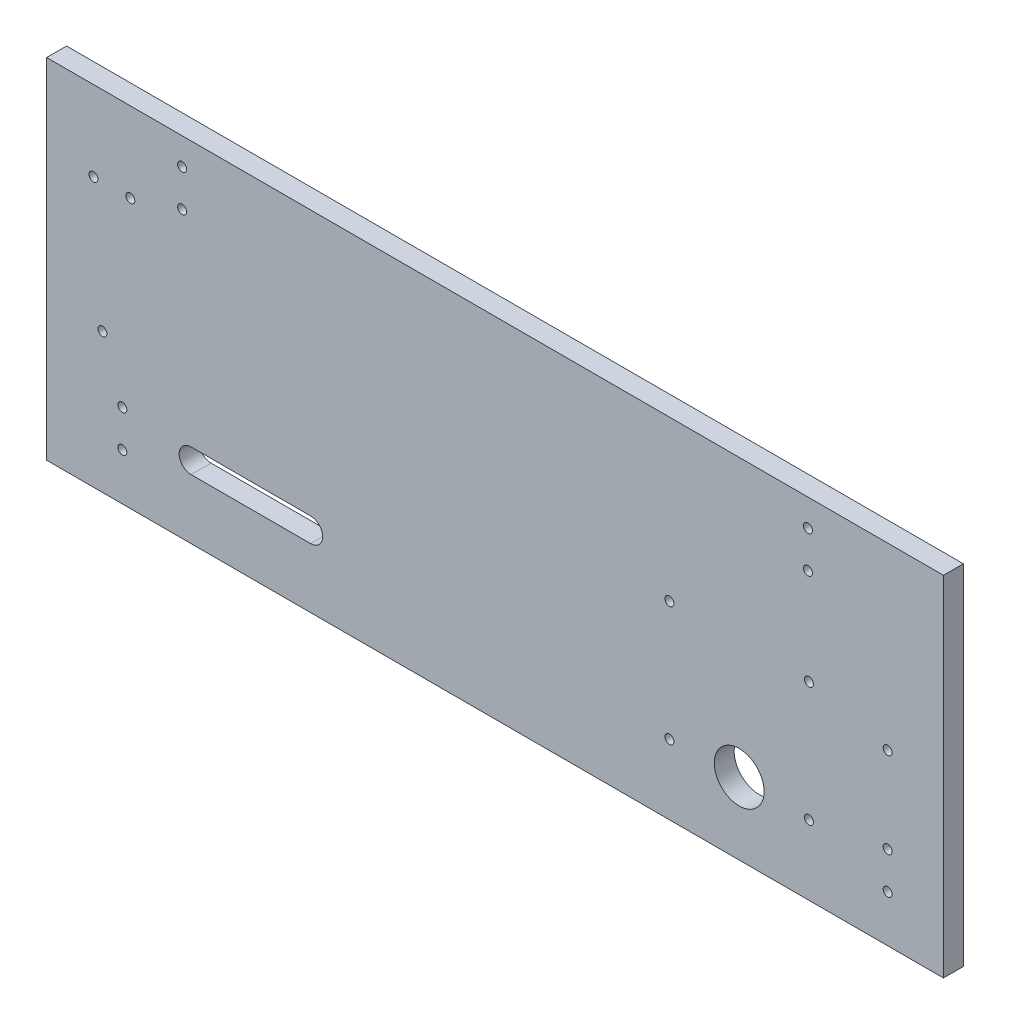
ISO-10303-21;
HEADER;
FILE_DESCRIPTION(('STEP AP214'),'2;1');
FILE_NAME('part.step','',(''),(''),'','','');
FILE_SCHEMA(('AUTOMOTIVE_DESIGN { 1 0 10303 214 1 1 1 1 }'));
ENDSEC;
DATA;
#1=APPLICATION_CONTEXT('core data for automotive mechanical design processes');
#2=APPLICATION_PROTOCOL_DEFINITION('international standard','automotive_design',2000,#1);
#3=PRODUCT_CONTEXT('',#1,'mechanical');
#4=PRODUCT('Part','Part','',(#3));
#5=PRODUCT_RELATED_PRODUCT_CATEGORY('part','',(#4));
#6=PRODUCT_DEFINITION_FORMATION('','',#4);
#7=PRODUCT_DEFINITION_CONTEXT('part definition',#1,'design');
#8=PRODUCT_DEFINITION('design','',#6,#7);
#9=PRODUCT_DEFINITION_SHAPE('','',#8);
#10=(LENGTH_UNIT() NAMED_UNIT(*) SI_UNIT(.MILLI.,.METRE.));
#11=(NAMED_UNIT(*) PLANE_ANGLE_UNIT() SI_UNIT($,.RADIAN.));
#12=(NAMED_UNIT(*) SI_UNIT($,.STERADIAN.) SOLID_ANGLE_UNIT());
#13=UNCERTAINTY_MEASURE_WITH_UNIT(LENGTH_MEASURE(1.E-05),#10,'distance_accuracy_value','');
#14=(GEOMETRIC_REPRESENTATION_CONTEXT(3) GLOBAL_UNCERTAINTY_ASSIGNED_CONTEXT((#13)) GLOBAL_UNIT_ASSIGNED_CONTEXT((#10,
#11,#12)) REPRESENTATION_CONTEXT('',''));
#15=CARTESIAN_POINT('',(0.,0.,0.));
#16=DIRECTION('',(0.,0.,1.));
#17=DIRECTION('',(1.,0.,0.));
#18=AXIS2_PLACEMENT_3D('',#15,#16,#17);
#19=CARTESIAN_POINT('',(0.,0.,10.));
#20=DIRECTION('',(1.,0.,0.));
#21=DIRECTION('',(0.,0.,-1.));
#22=AXIS2_PLACEMENT_3D('',#19,#20,#21);
#23=PLANE('',#22);
#24=DIRECTION('',(0.,-1.,0.));
#25=VECTOR('',#24,1.);
#26=CARTESIAN_POINT('',(0.,0.,0.));
#27=LINE('',#26,#25);
#28=CARTESIAN_POINT('',(0.,175.,0.));
#29=VERTEX_POINT('',#28);
#30=CARTESIAN_POINT('',(0.,0.,0.));
#31=VERTEX_POINT('',#30);
#32=EDGE_CURVE('E158',#29,#31,#27,.T.);
#33=ORIENTED_EDGE('',*,*,#32,.T.);
#34=DIRECTION('',(0.,0.,-1.));
#35=VECTOR('',#34,1.);
#36=CARTESIAN_POINT('',(0.,0.,10.));
#37=LINE('',#36,#35);
#38=CARTESIAN_POINT('',(0.,0.,10.));
#39=VERTEX_POINT('',#38);
#40=EDGE_CURVE('E11',#39,#31,#37,.T.);
#41=ORIENTED_EDGE('',*,*,#40,.F.);
#42=DIRECTION('',(0.,-1.,0.));
#43=VECTOR('',#42,1.);
#44=CARTESIAN_POINT('',(0.,0.,10.));
#45=LINE('',#44,#43);
#46=CARTESIAN_POINT('',(0.,175.,10.));
#47=VERTEX_POINT('',#46);
#48=EDGE_CURVE('E160',#47,#39,#45,.T.);
#49=ORIENTED_EDGE('',*,*,#48,.F.);
#50=DIRECTION('',(0.,0.,-1.));
#51=VECTOR('',#50,1.);
#52=CARTESIAN_POINT('',(0.,175.,10.));
#53=LINE('',#52,#51);
#54=EDGE_CURVE('E170',#47,#29,#53,.T.);
#55=ORIENTED_EDGE('',*,*,#54,.T.);
#56=EDGE_LOOP('',(#33,#41,#49,#55));
#57=FACE_BOUND('',#56,.T.);
#58=ADVANCED_FACE('F37',(#57),#23,.F.);
#59=CARTESIAN_POINT('',(0.,0.,10.));
#60=DIRECTION('',(0.,1.,0.));
#61=DIRECTION('',(0.,0.,1.));
#62=AXIS2_PLACEMENT_3D('',#59,#60,#61);
#63=PLANE('',#62);
#64=DIRECTION('',(1.,0.,0.));
#65=VECTOR('',#64,1.);
#66=CARTESIAN_POINT('',(0.,0.,0.));
#67=LINE('',#66,#65);
#68=CARTESIAN_POINT('',(450.,0.,0.));
#69=VERTEX_POINT('',#68);
#70=EDGE_CURVE('E173',#31,#69,#67,.T.);
#71=ORIENTED_EDGE('',*,*,#70,.T.);
#72=DIRECTION('',(0.,0.,-1.));
#73=VECTOR('',#72,1.);
#74=CARTESIAN_POINT('',(450.,0.,10.));
#75=LINE('',#74,#73);
#76=CARTESIAN_POINT('',(450.,0.,10.));
#77=VERTEX_POINT('',#76);
#78=EDGE_CURVE('E44',#77,#69,#75,.T.);
#79=ORIENTED_EDGE('',*,*,#78,.F.);
#80=DIRECTION('',(1.,0.,0.));
#81=VECTOR('',#80,1.);
#82=CARTESIAN_POINT('',(0.,0.,10.));
#83=LINE('',#82,#81);
#84=EDGE_CURVE('E163',#39,#77,#83,.T.);
#85=ORIENTED_EDGE('',*,*,#84,.F.);
#86=ORIENTED_EDGE('',*,*,#40,.T.);
#87=EDGE_LOOP('',(#71,#79,#85,#86));
#88=FACE_BOUND('',#87,.T.);
#89=ADVANCED_FACE('F202',(#88),#63,.F.);
#90=CARTESIAN_POINT('',(450.,0.,10.));
#91=DIRECTION('',(-1.,0.,0.));
#92=DIRECTION('',(0.,0.,1.));
#93=AXIS2_PLACEMENT_3D('',#90,#91,#92);
#94=PLANE('',#93);
#95=DIRECTION('',(0.,1.,0.));
#96=VECTOR('',#95,1.);
#97=CARTESIAN_POINT('',(450.,0.,0.));
#98=LINE('',#97,#96);
#99=CARTESIAN_POINT('',(450.,175.,0.));
#100=VERTEX_POINT('',#99);
#101=EDGE_CURVE('E175',#69,#100,#98,.T.);
#102=ORIENTED_EDGE('',*,*,#101,.T.);
#103=DIRECTION('',(0.,0.,-1.));
#104=VECTOR('',#103,1.);
#105=CARTESIAN_POINT('',(450.,175.,10.));
#106=LINE('',#105,#104);
#107=CARTESIAN_POINT('',(450.,175.,10.));
#108=VERTEX_POINT('',#107);
#109=EDGE_CURVE('E180',#108,#100,#106,.T.);
#110=ORIENTED_EDGE('',*,*,#109,.F.);
#111=DIRECTION('',(0.,1.,0.));
#112=VECTOR('',#111,1.);
#113=CARTESIAN_POINT('',(450.,0.,10.));
#114=LINE('',#113,#112);
#115=EDGE_CURVE('E166',#77,#108,#114,.T.);
#116=ORIENTED_EDGE('',*,*,#115,.F.);
#117=ORIENTED_EDGE('',*,*,#78,.T.);
#118=EDGE_LOOP('',(#102,#110,#116,#117));
#119=FACE_BOUND('',#118,.T.);
#120=ADVANCED_FACE('F187',(#119),#94,.F.);
#121=CARTESIAN_POINT('',(0.,175.,10.));
#122=DIRECTION('',(0.,-1.,0.));
#123=DIRECTION('',(0.,0.,-1.));
#124=AXIS2_PLACEMENT_3D('',#121,#122,#123);
#125=PLANE('',#124);
#126=DIRECTION('',(-1.,0.,0.));
#127=VECTOR('',#126,1.);
#128=CARTESIAN_POINT('',(0.,175.,0.));
#129=LINE('',#128,#127);
#130=EDGE_CURVE('E164',#100,#29,#129,.T.);
#131=ORIENTED_EDGE('',*,*,#130,.T.);
#132=ORIENTED_EDGE('',*,*,#54,.F.);
#133=DIRECTION('',(-1.,0.,0.));
#134=VECTOR('',#133,1.);
#135=CARTESIAN_POINT('',(0.,175.,10.));
#136=LINE('',#135,#134);
#137=EDGE_CURVE('E168',#108,#47,#136,.T.);
#138=ORIENTED_EDGE('',*,*,#137,.F.);
#139=ORIENTED_EDGE('',*,*,#109,.T.);
#140=EDGE_LOOP('',(#131,#132,#138,#139));
#141=FACE_BOUND('',#140,.T.);
#142=ADVANCED_FACE('F196',(#141),#125,.F.);
#143=CARTESIAN_POINT('',(0.,0.,10.));
#144=DIRECTION('',(0.,0.,-1.));
#145=DIRECTION('',(-1.,0.,0.));
#146=AXIS2_PLACEMENT_3D('',#143,#144,#145);
#147=PLANE('',#146);
#148=CARTESIAN_POINT('',(68.0000000000001,161.5,10.));
#149=DIRECTION('',(0.,0.,1.));
#150=DIRECTION('',(1.,0.,0.));
#151=AXIS2_PLACEMENT_3D('',#148,#149,#150);
#152=CIRCLE('',#151,2.25);
#153=CARTESIAN_POINT('',(70.2500000000001,161.5,10.));
#154=VERTEX_POINT('',#153);
#155=EDGE_CURVE('E341',#154,#154,#152,.T.);
#156=ORIENTED_EDGE('',*,*,#155,.F.);
#157=EDGE_LOOP('',(#156));
#158=FACE_BOUND('',#157,.T.);
#159=CARTESIAN_POINT('',(382.,143.,10.));
#160=DIRECTION('',(0.,0.,1.));
#161=DIRECTION('',(1.,0.,0.));
#162=AXIS2_PLACEMENT_3D('',#159,#160,#161);
#163=CIRCLE('',#162,2.24999999999996);
#164=CARTESIAN_POINT('',(384.25,143.,10.));
#165=VERTEX_POINT('',#164);
#166=EDGE_CURVE('E334',#165,#165,#163,.T.);
#167=ORIENTED_EDGE('',*,*,#166,.F.);
#168=EDGE_LOOP('',(#167));
#169=FACE_BOUND('',#168,.T.);
#170=CARTESIAN_POINT('',(382.,161.5,10.));
#171=DIRECTION('',(0.,0.,1.));
#172=DIRECTION('',(1.,0.,0.));
#173=AXIS2_PLACEMENT_3D('',#170,#171,#172);
#174=CIRCLE('',#173,2.24999999999996);
#175=CARTESIAN_POINT('',(384.25,161.5,10.));
#176=VERTEX_POINT('',#175);
#177=EDGE_CURVE('E353',#176,#176,#174,.T.);
#178=ORIENTED_EDGE('',*,*,#177,.F.);
#179=EDGE_LOOP('',(#178));
#180=FACE_BOUND('',#179,.T.);
#181=CARTESIAN_POINT('',(422.,84.9999999999999,10.));
#182=DIRECTION('',(0.,0.,1.));
#183=DIRECTION('',(1.,0.,0.));
#184=AXIS2_PLACEMENT_3D('',#181,#182,#183);
#185=CIRCLE('',#184,2.24999999999995);
#186=CARTESIAN_POINT('',(424.25,84.9999999999999,10.));
#187=VERTEX_POINT('',#186);
#188=EDGE_CURVE('E346',#187,#187,#185,.T.);
#189=ORIENTED_EDGE('',*,*,#188,.F.);
#190=EDGE_LOOP('',(#189));
#191=FACE_BOUND('',#190,.T.);
#192=CARTESIAN_POINT('',(68.0000000000001,143.,10.));
#193=DIRECTION('',(0.,0.,1.));
#194=DIRECTION('',(1.,0.,0.));
#195=AXIS2_PLACEMENT_3D('',#192,#193,#194);
#196=CIRCLE('',#195,2.25);
#197=CARTESIAN_POINT('',(70.2500000000001,143.,10.));
#198=VERTEX_POINT('',#197);
#199=EDGE_CURVE('E313',#198,#198,#196,.T.);
#200=ORIENTED_EDGE('',*,*,#199,.F.);
#201=EDGE_LOOP('',(#200));
#202=FACE_BOUND('',#201,.T.);
#203=CARTESIAN_POINT('',(38.,42.,10.));
#204=DIRECTION('',(0.,0.,1.));
#205=DIRECTION('',(1.,0.,0.));
#206=AXIS2_PLACEMENT_3D('',#203,#204,#205);
#207=CIRCLE('',#206,2.25);
#208=CARTESIAN_POINT('',(40.25,42.,10.));
#209=VERTEX_POINT('',#208);
#210=EDGE_CURVE('E320',#209,#209,#207,.T.);
#211=ORIENTED_EDGE('',*,*,#210,.F.);
#212=EDGE_LOOP('',(#211));
#213=FACE_BOUND('',#212,.T.);
#214=CARTESIAN_POINT('',(38.,23.5,10.));
#215=DIRECTION('',(0.,0.,1.));
#216=DIRECTION('',(1.,0.,0.));
#217=AXIS2_PLACEMENT_3D('',#214,#215,#216);
#218=CIRCLE('',#217,2.25);
#219=CARTESIAN_POINT('',(40.25,23.5,10.));
#220=VERTEX_POINT('',#219);
#221=EDGE_CURVE('E326',#220,#220,#218,.T.);
#222=ORIENTED_EDGE('',*,*,#221,.F.);
#223=EDGE_LOOP('',(#222));
#224=FACE_BOUND('',#223,.T.);
#225=CARTESIAN_POINT('',(422.,23.4999999999999,10.));
#226=DIRECTION('',(0.,0.,1.));
#227=DIRECTION('',(1.,0.,0.));
#228=AXIS2_PLACEMENT_3D('',#225,#226,#227);
#229=CIRCLE('',#228,2.24999999999995);
#230=CARTESIAN_POINT('',(424.25,23.4999999999999,10.));
#231=VERTEX_POINT('',#230);
#232=EDGE_CURVE('E309',#231,#231,#229,.T.);
#233=ORIENTED_EDGE('',*,*,#232,.F.);
#234=EDGE_LOOP('',(#233));
#235=FACE_BOUND('',#234,.T.);
#236=DIRECTION('',(1.,0.,0.));
#237=VECTOR('',#236,1.);
#238=CARTESIAN_POINT('',(72.5,30.,10.));
#239=LINE('',#238,#237);
#240=CARTESIAN_POINT('',(72.5,30.,10.));
#241=VERTEX_POINT('',#240);
#242=CARTESIAN_POINT('',(132.5,30.,10.));
#243=VERTEX_POINT('',#242);
#244=EDGE_CURVE('E122',#241,#243,#239,.T.);
#245=ORIENTED_EDGE('',*,*,#244,.F.);
#246=CARTESIAN_POINT('',(72.5,36.,10.));
#247=DIRECTION('',(0.,0.,1.));
#248=DIRECTION('',(1.,0.,0.));
#249=AXIS2_PLACEMENT_3D('',#246,#247,#248);
#250=CIRCLE('',#249,5.99999999999999);
#251=CARTESIAN_POINT('',(72.5,42.,10.));
#252=VERTEX_POINT('',#251);
#253=EDGE_CURVE('E51',#252,#241,#250,.T.);
#254=ORIENTED_EDGE('',*,*,#253,.F.);
#255=DIRECTION('',(-1.,0.,0.));
#256=VECTOR('',#255,1.);
#257=CARTESIAN_POINT('',(72.5,42.,10.));
#258=LINE('',#257,#256);
#259=CARTESIAN_POINT('',(132.5,42.,10.));
#260=VERTEX_POINT('',#259);
#261=EDGE_CURVE('E111',#260,#252,#258,.T.);
#262=ORIENTED_EDGE('',*,*,#261,.F.);
#263=CARTESIAN_POINT('',(132.5,36.,10.));
#264=DIRECTION('',(0.,0.,1.));
#265=DIRECTION('',(1.,0.,0.));
#266=AXIS2_PLACEMENT_3D('',#263,#264,#265);
#267=CIRCLE('',#266,5.99999999999999);
#268=EDGE_CURVE('E116',#243,#260,#267,.T.);
#269=ORIENTED_EDGE('',*,*,#268,.F.);
#270=EDGE_LOOP('',(#245,#254,#262,#269));
#271=FACE_BOUND('',#270,.T.);
#272=CARTESIAN_POINT('',(312.5,94.9999999999998,10.));
#273=DIRECTION('',(0.,0.,1.));
#274=DIRECTION('',(1.,0.,0.));
#275=AXIS2_PLACEMENT_3D('',#272,#273,#274);
#276=CIRCLE('',#275,2.24999999999995);
#277=CARTESIAN_POINT('',(314.75,94.9999999999998,10.));
#278=VERTEX_POINT('',#277);
#279=EDGE_CURVE('E108',#278,#278,#276,.T.);
#280=ORIENTED_EDGE('',*,*,#279,.F.);
#281=EDGE_LOOP('',(#280));
#282=FACE_BOUND('',#281,.T.);
#283=CARTESIAN_POINT('',(382.5,94.9999999999998,10.));
#284=DIRECTION('',(0.,0.,1.));
#285=DIRECTION('',(1.,0.,0.));
#286=AXIS2_PLACEMENT_3D('',#283,#284,#285);
#287=CIRCLE('',#286,2.25000000000001);
#288=CARTESIAN_POINT('',(384.75,94.9999999999998,10.));
#289=VERTEX_POINT('',#288);
#290=EDGE_CURVE('E144',#289,#289,#287,.T.);
#291=ORIENTED_EDGE('',*,*,#290,.F.);
#292=EDGE_LOOP('',(#291));
#293=FACE_BOUND('',#292,.T.);
#294=CARTESIAN_POINT('',(382.5,34.9999999999998,10.));
#295=DIRECTION('',(0.,0.,1.));
#296=DIRECTION('',(1.,0.,0.));
#297=AXIS2_PLACEMENT_3D('',#294,#295,#296);
#298=CIRCLE('',#297,2.24999999999995);
#299=CARTESIAN_POINT('',(384.75,34.9999999999998,10.));
#300=VERTEX_POINT('',#299);
#301=EDGE_CURVE('E150',#300,#300,#298,.T.);
#302=ORIENTED_EDGE('',*,*,#301,.F.);
#303=EDGE_LOOP('',(#302));
#304=FACE_BOUND('',#303,.T.);
#305=CARTESIAN_POINT('',(28.0000000000001,70.,10.));
#306=DIRECTION('',(0.,0.,1.));
#307=DIRECTION('',(1.,0.,0.));
#308=AXIS2_PLACEMENT_3D('',#305,#306,#307);
#309=CIRCLE('',#308,2.25);
#310=CARTESIAN_POINT('',(30.2500000000001,70.,10.));
#311=VERTEX_POINT('',#310);
#312=EDGE_CURVE('E365',#311,#311,#309,.T.);
#313=ORIENTED_EDGE('',*,*,#312,.F.);
#314=EDGE_LOOP('',(#313));
#315=FACE_BOUND('',#314,.T.);
#316=CARTESIAN_POINT('',(42.0000000000001,134.933694221876,10.));
#317=DIRECTION('',(0.,0.,1.));
#318=DIRECTION('',(1.,0.,0.));
#319=AXIS2_PLACEMENT_3D('',#316,#317,#318);
#320=CIRCLE('',#319,2.25);
#321=CARTESIAN_POINT('',(44.2500000000001,134.933694221876,10.));
#322=VERTEX_POINT('',#321);
#323=EDGE_CURVE('E358',#322,#322,#320,.T.);
#324=ORIENTED_EDGE('',*,*,#323,.F.);
#325=EDGE_LOOP('',(#324));
#326=FACE_BOUND('',#325,.T.);
#327=CARTESIAN_POINT('',(23.5000000000001,134.933694221876,10.));
#328=DIRECTION('',(0.,0.,1.));
#329=DIRECTION('',(1.,0.,0.));
#330=AXIS2_PLACEMENT_3D('',#327,#328,#329);
#331=CIRCLE('',#330,2.25);
#332=CARTESIAN_POINT('',(25.7500000000001,134.933694221876,10.));
#333=VERTEX_POINT('',#332);
#334=EDGE_CURVE('E375',#333,#333,#331,.T.);
#335=ORIENTED_EDGE('',*,*,#334,.F.);
#336=EDGE_LOOP('',(#335));
#337=FACE_BOUND('',#336,.T.);
#338=CARTESIAN_POINT('',(312.5,34.9999999999998,10.));
#339=DIRECTION('',(0.,0.,1.));
#340=DIRECTION('',(1.,0.,0.));
#341=AXIS2_PLACEMENT_3D('',#338,#339,#340);
#342=CIRCLE('',#341,2.24999999999995);
#343=CARTESIAN_POINT('',(314.75,34.9999999999998,10.));
#344=VERTEX_POINT('',#343);
#345=EDGE_CURVE('E156',#344,#344,#342,.T.);
#346=ORIENTED_EDGE('',*,*,#345,.F.);
#347=EDGE_LOOP('',(#346));
#348=FACE_BOUND('',#347,.T.);
#349=CARTESIAN_POINT('',(422.,41.9999999999999,10.));
#350=DIRECTION('',(0.,0.,1.));
#351=DIRECTION('',(1.,0.,0.));
#352=AXIS2_PLACEMENT_3D('',#349,#350,#351);
#353=CIRCLE('',#352,2.24999999999995);
#354=CARTESIAN_POINT('',(424.25,41.9999999999999,10.));
#355=VERTEX_POINT('',#354);
#356=EDGE_CURVE('E304',#355,#355,#353,.T.);
#357=ORIENTED_EDGE('',*,*,#356,.F.);
#358=EDGE_LOOP('',(#357));
#359=FACE_BOUND('',#358,.T.);
#360=CARTESIAN_POINT('',(347.5,36.,10.));
#361=DIRECTION('',(0.,0.,1.));
#362=DIRECTION('',(1.,0.,0.));
#363=AXIS2_PLACEMENT_3D('',#360,#361,#362);
#364=CIRCLE('',#363,12.5);
#365=CARTESIAN_POINT('',(360.,36.,10.));
#366=VERTEX_POINT('',#365);
#367=EDGE_CURVE('E123',#366,#366,#364,.T.);
#368=ORIENTED_EDGE('',*,*,#367,.F.);
#369=EDGE_LOOP('',(#368));
#370=FACE_BOUND('',#369,.T.);
#371=ORIENTED_EDGE('',*,*,#48,.T.);
#372=ORIENTED_EDGE('',*,*,#84,.T.);
#373=ORIENTED_EDGE('',*,*,#115,.T.);
#374=ORIENTED_EDGE('',*,*,#137,.T.);
#375=EDGE_LOOP('',(#371,#372,#373,#374));
#376=FACE_BOUND('',#375,.T.);
#377=ADVANCED_FACE('F119',(#158,#169,#180,#191,#202,#213,#224,#235,#271,#282,#293,#304,#315,
#326,#337,#348,#359,#370,#376),#147,.F.);
#378=CARTESIAN_POINT('',(0.,0.,0.));
#379=DIRECTION('',(0.,0.,-1.));
#380=DIRECTION('',(-1.,0.,0.));
#381=AXIS2_PLACEMENT_3D('',#378,#379,#380);
#382=PLANE('',#381);
#383=CARTESIAN_POINT('',(68.0000000000001,161.5,0.));
#384=DIRECTION('',(0.,0.,1.));
#385=DIRECTION('',(1.,0.,0.));
#386=AXIS2_PLACEMENT_3D('',#383,#384,#385);
#387=CIRCLE('',#386,2.25);
#388=CARTESIAN_POINT('',(70.2500000000001,161.5,0.));
#389=VERTEX_POINT('',#388);
#390=EDGE_CURVE('E316',#389,#389,#387,.T.);
#391=ORIENTED_EDGE('',*,*,#390,.T.);
#392=EDGE_LOOP('',(#391));
#393=FACE_BOUND('',#392,.T.);
#394=CARTESIAN_POINT('',(382.,143.,0.));
#395=DIRECTION('',(0.,0.,1.));
#396=DIRECTION('',(1.,0.,0.));
#397=AXIS2_PLACEMENT_3D('',#394,#395,#396);
#398=CIRCLE('',#397,2.24999999999996);
#399=CARTESIAN_POINT('',(384.25,143.,0.));
#400=VERTEX_POINT('',#399);
#401=EDGE_CURVE('E338',#400,#400,#398,.T.);
#402=ORIENTED_EDGE('',*,*,#401,.T.);
#403=EDGE_LOOP('',(#402));
#404=FACE_BOUND('',#403,.T.);
#405=CARTESIAN_POINT('',(382.,161.5,0.));
#406=DIRECTION('',(0.,0.,1.));
#407=DIRECTION('',(1.,0.,0.));
#408=AXIS2_PLACEMENT_3D('',#405,#406,#407);
#409=CIRCLE('',#408,2.24999999999996);
#410=CARTESIAN_POINT('',(384.25,161.5,0.));
#411=VERTEX_POINT('',#410);
#412=EDGE_CURVE('E337',#411,#411,#409,.T.);
#413=ORIENTED_EDGE('',*,*,#412,.T.);
#414=EDGE_LOOP('',(#413));
#415=FACE_BOUND('',#414,.T.);
#416=CARTESIAN_POINT('',(422.,84.9999999999999,0.));
#417=DIRECTION('',(0.,0.,1.));
#418=DIRECTION('',(1.,0.,0.));
#419=AXIS2_PLACEMENT_3D('',#416,#417,#418);
#420=CIRCLE('',#419,2.24999999999995);
#421=CARTESIAN_POINT('',(424.25,84.9999999999999,0.));
#422=VERTEX_POINT('',#421);
#423=EDGE_CURVE('E350',#422,#422,#420,.T.);
#424=ORIENTED_EDGE('',*,*,#423,.T.);
#425=EDGE_LOOP('',(#424));
#426=FACE_BOUND('',#425,.T.);
#427=CARTESIAN_POINT('',(68.0000000000001,143.,0.));
#428=DIRECTION('',(0.,0.,1.));
#429=DIRECTION('',(1.,0.,0.));
#430=AXIS2_PLACEMENT_3D('',#427,#428,#429);
#431=CIRCLE('',#430,2.25);
#432=CARTESIAN_POINT('',(70.2500000000001,143.,0.));
#433=VERTEX_POINT('',#432);
#434=EDGE_CURVE('E317',#433,#433,#431,.T.);
#435=ORIENTED_EDGE('',*,*,#434,.T.);
#436=EDGE_LOOP('',(#435));
#437=FACE_BOUND('',#436,.T.);
#438=CARTESIAN_POINT('',(38.,42.,0.));
#439=DIRECTION('',(0.,0.,1.));
#440=DIRECTION('',(1.,0.,0.));
#441=AXIS2_PLACEMENT_3D('',#438,#439,#440);
#442=CIRCLE('',#441,2.25);
#443=CARTESIAN_POINT('',(40.25,42.,0.));
#444=VERTEX_POINT('',#443);
#445=EDGE_CURVE('E323',#444,#444,#442,.T.);
#446=ORIENTED_EDGE('',*,*,#445,.T.);
#447=EDGE_LOOP('',(#446));
#448=FACE_BOUND('',#447,.T.);
#449=CARTESIAN_POINT('',(38.,23.5,0.));
#450=DIRECTION('',(0.,0.,1.));
#451=DIRECTION('',(1.,0.,0.));
#452=AXIS2_PLACEMENT_3D('',#449,#450,#451);
#453=CIRCLE('',#452,2.25);
#454=CARTESIAN_POINT('',(40.25,23.5,0.));
#455=VERTEX_POINT('',#454);
#456=EDGE_CURVE('E329',#455,#455,#453,.T.);
#457=ORIENTED_EDGE('',*,*,#456,.T.);
#458=EDGE_LOOP('',(#457));
#459=FACE_BOUND('',#458,.T.);
#460=CARTESIAN_POINT('',(422.,23.4999999999999,0.));
#461=DIRECTION('',(0.,0.,1.));
#462=DIRECTION('',(1.,0.,0.));
#463=AXIS2_PLACEMENT_3D('',#460,#461,#462);
#464=CIRCLE('',#463,2.24999999999995);
#465=CARTESIAN_POINT('',(424.25,23.4999999999999,0.));
#466=VERTEX_POINT('',#465);
#467=EDGE_CURVE('E306',#466,#466,#464,.T.);
#468=ORIENTED_EDGE('',*,*,#467,.T.);
#469=EDGE_LOOP('',(#468));
#470=FACE_BOUND('',#469,.T.);
#471=CARTESIAN_POINT('',(72.5,36.,0.));
#472=DIRECTION('',(0.,0.,1.));
#473=DIRECTION('',(1.,0.,0.));
#474=AXIS2_PLACEMENT_3D('',#471,#472,#473);
#475=CIRCLE('',#474,5.99999999999999);
#476=CARTESIAN_POINT('',(72.5,42.,0.));
#477=VERTEX_POINT('',#476);
#478=CARTESIAN_POINT('',(72.5,30.,0.));
#479=VERTEX_POINT('',#478);
#480=EDGE_CURVE('E103',#477,#479,#475,.T.);
#481=ORIENTED_EDGE('',*,*,#480,.T.);
#482=DIRECTION('',(1.,0.,0.));
#483=VECTOR('',#482,1.);
#484=CARTESIAN_POINT('',(72.5,30.,0.));
#485=LINE('',#484,#483);
#486=CARTESIAN_POINT('',(132.5,30.,0.));
#487=VERTEX_POINT('',#486);
#488=EDGE_CURVE('E135',#479,#487,#485,.T.);
#489=ORIENTED_EDGE('',*,*,#488,.T.);
#490=CARTESIAN_POINT('',(132.5,36.,0.));
#491=DIRECTION('',(0.,0.,1.));
#492=DIRECTION('',(1.,0.,0.));
#493=AXIS2_PLACEMENT_3D('',#490,#491,#492);
#494=CIRCLE('',#493,5.99999999999999);
#495=CARTESIAN_POINT('',(132.5,42.,0.));
#496=VERTEX_POINT('',#495);
#497=EDGE_CURVE('E59',#487,#496,#494,.T.);
#498=ORIENTED_EDGE('',*,*,#497,.T.);
#499=DIRECTION('',(-1.,0.,0.));
#500=VECTOR('',#499,1.);
#501=CARTESIAN_POINT('',(72.5,42.,0.));
#502=LINE('',#501,#500);
#503=EDGE_CURVE('E131',#496,#477,#502,.T.);
#504=ORIENTED_EDGE('',*,*,#503,.T.);
#505=EDGE_LOOP('',(#481,#489,#498,#504));
#506=FACE_BOUND('',#505,.T.);
#507=CARTESIAN_POINT('',(312.5,94.9999999999998,0.));
#508=DIRECTION('',(0.,0.,1.));
#509=DIRECTION('',(1.,0.,0.));
#510=AXIS2_PLACEMENT_3D('',#507,#508,#509);
#511=CIRCLE('',#510,2.24999999999995);
#512=CARTESIAN_POINT('',(314.75,94.9999999999998,0.));
#513=VERTEX_POINT('',#512);
#514=EDGE_CURVE('E141',#513,#513,#511,.T.);
#515=ORIENTED_EDGE('',*,*,#514,.T.);
#516=EDGE_LOOP('',(#515));
#517=FACE_BOUND('',#516,.T.);
#518=CARTESIAN_POINT('',(382.5,94.9999999999998,0.));
#519=DIRECTION('',(0.,0.,1.));
#520=DIRECTION('',(1.,0.,0.));
#521=AXIS2_PLACEMENT_3D('',#518,#519,#520);
#522=CIRCLE('',#521,2.25000000000001);
#523=CARTESIAN_POINT('',(384.75,94.9999999999998,0.));
#524=VERTEX_POINT('',#523);
#525=EDGE_CURVE('E147',#524,#524,#522,.T.);
#526=ORIENTED_EDGE('',*,*,#525,.T.);
#527=EDGE_LOOP('',(#526));
#528=FACE_BOUND('',#527,.T.);
#529=CARTESIAN_POINT('',(382.5,34.9999999999998,0.));
#530=DIRECTION('',(0.,0.,1.));
#531=DIRECTION('',(1.,0.,0.));
#532=AXIS2_PLACEMENT_3D('',#529,#530,#531);
#533=CIRCLE('',#532,2.24999999999995);
#534=CARTESIAN_POINT('',(384.75,34.9999999999998,0.));
#535=VERTEX_POINT('',#534);
#536=EDGE_CURVE('E153',#535,#535,#533,.T.);
#537=ORIENTED_EDGE('',*,*,#536,.T.);
#538=EDGE_LOOP('',(#537));
#539=FACE_BOUND('',#538,.T.);
#540=CARTESIAN_POINT('',(28.0000000000001,70.,0.));
#541=DIRECTION('',(0.,0.,1.));
#542=DIRECTION('',(1.,0.,0.));
#543=AXIS2_PLACEMENT_3D('',#540,#541,#542);
#544=CIRCLE('',#543,2.25);
#545=CARTESIAN_POINT('',(30.2500000000001,70.,0.));
#546=VERTEX_POINT('',#545);
#547=EDGE_CURVE('E349',#546,#546,#544,.T.);
#548=ORIENTED_EDGE('',*,*,#547,.T.);
#549=EDGE_LOOP('',(#548));
#550=FACE_BOUND('',#549,.T.);
#551=CARTESIAN_POINT('',(42.0000000000001,134.933694221876,0.));
#552=DIRECTION('',(0.,0.,1.));
#553=DIRECTION('',(1.,0.,0.));
#554=AXIS2_PLACEMENT_3D('',#551,#552,#553);
#555=CIRCLE('',#554,2.25);
#556=CARTESIAN_POINT('',(44.2500000000001,134.933694221876,0.));
#557=VERTEX_POINT('',#556);
#558=EDGE_CURVE('E362',#557,#557,#555,.T.);
#559=ORIENTED_EDGE('',*,*,#558,.T.);
#560=EDGE_LOOP('',(#559));
#561=FACE_BOUND('',#560,.T.);
#562=CARTESIAN_POINT('',(23.5000000000001,134.933694221876,0.));
#563=DIRECTION('',(0.,0.,1.));
#564=DIRECTION('',(1.,0.,0.));
#565=AXIS2_PLACEMENT_3D('',#562,#563,#564);
#566=CIRCLE('',#565,2.25);
#567=CARTESIAN_POINT('',(25.7500000000001,134.933694221876,0.));
#568=VERTEX_POINT('',#567);
#569=EDGE_CURVE('E361',#568,#568,#566,.T.);
#570=ORIENTED_EDGE('',*,*,#569,.T.);
#571=EDGE_LOOP('',(#570));
#572=FACE_BOUND('',#571,.T.);
#573=CARTESIAN_POINT('',(312.5,34.9999999999998,0.));
#574=DIRECTION('',(0.,0.,1.));
#575=DIRECTION('',(1.,0.,0.));
#576=AXIS2_PLACEMENT_3D('',#573,#574,#575);
#577=CIRCLE('',#576,2.24999999999995);
#578=CARTESIAN_POINT('',(314.75,34.9999999999998,0.));
#579=VERTEX_POINT('',#578);
#580=EDGE_CURVE('E372',#579,#579,#577,.T.);
#581=ORIENTED_EDGE('',*,*,#580,.T.);
#582=EDGE_LOOP('',(#581));
#583=FACE_BOUND('',#582,.T.);
#584=CARTESIAN_POINT('',(422.,41.9999999999999,0.));
#585=DIRECTION('',(0.,0.,1.));
#586=DIRECTION('',(1.,0.,0.));
#587=AXIS2_PLACEMENT_3D('',#584,#585,#586);
#588=CIRCLE('',#587,2.24999999999995);
#589=CARTESIAN_POINT('',(424.25,41.9999999999999,0.));
#590=VERTEX_POINT('',#589);
#591=EDGE_CURVE('E301',#590,#590,#588,.T.);
#592=ORIENTED_EDGE('',*,*,#591,.T.);
#593=EDGE_LOOP('',(#592));
#594=FACE_BOUND('',#593,.T.);
#595=CARTESIAN_POINT('',(347.5,36.,0.));
#596=DIRECTION('',(0.,0.,1.));
#597=DIRECTION('',(1.,0.,0.));
#598=AXIS2_PLACEMENT_3D('',#595,#596,#597);
#599=CIRCLE('',#598,12.5);
#600=CARTESIAN_POINT('',(360.,36.,0.));
#601=VERTEX_POINT('',#600);
#602=EDGE_CURVE('E126',#601,#601,#599,.T.);
#603=ORIENTED_EDGE('',*,*,#602,.T.);
#604=EDGE_LOOP('',(#603));
#605=FACE_BOUND('',#604,.T.);
#606=ORIENTED_EDGE('',*,*,#32,.F.);
#607=ORIENTED_EDGE('',*,*,#130,.F.);
#608=ORIENTED_EDGE('',*,*,#101,.F.);
#609=ORIENTED_EDGE('',*,*,#70,.F.);
#610=EDGE_LOOP('',(#606,#607,#608,#609));
#611=FACE_BOUND('',#610,.T.);
#612=ADVANCED_FACE('F193',(#393,#404,#415,#426,#437,#448,#459,#470,#506,#517,#528,#539,#550,
#561,#572,#583,#594,#605,#611),#382,.T.);
#613=CARTESIAN_POINT('',(347.5,36.,0.));
#614=DIRECTION('',(0.,0.,1.));
#615=DIRECTION('',(1.,0.,0.));
#616=AXIS2_PLACEMENT_3D('',#613,#614,#615);
#617=CYLINDRICAL_SURFACE('',#616,12.5);
#618=ORIENTED_EDGE('',*,*,#602,.F.);
#619=EDGE_LOOP('',(#618));
#620=FACE_BOUND('',#619,.T.);
#621=ORIENTED_EDGE('',*,*,#367,.T.);
#622=EDGE_LOOP('',(#621));
#623=FACE_BOUND('',#622,.T.);
#624=ADVANCED_FACE('F214',(#620,#623),#617,.F.);
#625=CARTESIAN_POINT('',(422.,41.9999999999999,0.));
#626=DIRECTION('',(0.,0.,1.));
#627=DIRECTION('',(1.,0.,0.));
#628=AXIS2_PLACEMENT_3D('',#625,#626,#627);
#629=CYLINDRICAL_SURFACE('',#628,2.24999999999995);
#630=ORIENTED_EDGE('',*,*,#591,.F.);
#631=EDGE_LOOP('',(#630));
#632=FACE_BOUND('',#631,.T.);
#633=ORIENTED_EDGE('',*,*,#356,.T.);
#634=EDGE_LOOP('',(#633));
#635=FACE_BOUND('',#634,.T.);
#636=ADVANCED_FACE('F221',(#632,#635),#629,.F.);
#637=CARTESIAN_POINT('',(312.5,34.9999999999998,0.));
#638=DIRECTION('',(0.,0.,1.));
#639=DIRECTION('',(1.,0.,0.));
#640=AXIS2_PLACEMENT_3D('',#637,#638,#639);
#641=CYLINDRICAL_SURFACE('',#640,2.24999999999995);
#642=ORIENTED_EDGE('',*,*,#580,.F.);
#643=EDGE_LOOP('',(#642));
#644=FACE_BOUND('',#643,.T.);
#645=ORIENTED_EDGE('',*,*,#345,.T.);
#646=EDGE_LOOP('',(#645));
#647=FACE_BOUND('',#646,.T.);
#648=ADVANCED_FACE('F252',(#644,#647),#641,.F.);
#649=CARTESIAN_POINT('',(23.5000000000001,134.933694221876,0.));
#650=DIRECTION('',(0.,0.,1.));
#651=DIRECTION('',(1.,0.,0.));
#652=AXIS2_PLACEMENT_3D('',#649,#650,#651);
#653=CYLINDRICAL_SURFACE('',#652,2.25);
#654=ORIENTED_EDGE('',*,*,#569,.F.);
#655=EDGE_LOOP('',(#654));
#656=FACE_BOUND('',#655,.T.);
#657=ORIENTED_EDGE('',*,*,#334,.T.);
#658=EDGE_LOOP('',(#657));
#659=FACE_BOUND('',#658,.T.);
#660=ADVANCED_FACE('F248',(#656,#659),#653,.F.);
#661=CARTESIAN_POINT('',(42.0000000000001,134.933694221876,0.));
#662=DIRECTION('',(0.,0.,1.));
#663=DIRECTION('',(1.,0.,0.));
#664=AXIS2_PLACEMENT_3D('',#661,#662,#663);
#665=CYLINDRICAL_SURFACE('',#664,2.25);
#666=ORIENTED_EDGE('',*,*,#558,.F.);
#667=EDGE_LOOP('',(#666));
#668=FACE_BOUND('',#667,.T.);
#669=ORIENTED_EDGE('',*,*,#323,.T.);
#670=EDGE_LOOP('',(#669));
#671=FACE_BOUND('',#670,.T.);
#672=ADVANCED_FACE('F251',(#668,#671),#665,.F.);
#673=CARTESIAN_POINT('',(28.0000000000001,70.,0.));
#674=DIRECTION('',(0.,0.,1.));
#675=DIRECTION('',(1.,0.,0.));
#676=AXIS2_PLACEMENT_3D('',#673,#674,#675);
#677=CYLINDRICAL_SURFACE('',#676,2.25);
#678=ORIENTED_EDGE('',*,*,#547,.F.);
#679=EDGE_LOOP('',(#678));
#680=FACE_BOUND('',#679,.T.);
#681=ORIENTED_EDGE('',*,*,#312,.T.);
#682=EDGE_LOOP('',(#681));
#683=FACE_BOUND('',#682,.T.);
#684=ADVANCED_FACE('F227',(#680,#683),#677,.F.);
#685=CARTESIAN_POINT('',(382.5,34.9999999999998,0.));
#686=DIRECTION('',(0.,0.,1.));
#687=DIRECTION('',(1.,0.,0.));
#688=AXIS2_PLACEMENT_3D('',#685,#686,#687);
#689=CYLINDRICAL_SURFACE('',#688,2.24999999999995);
#690=ORIENTED_EDGE('',*,*,#536,.F.);
#691=EDGE_LOOP('',(#690));
#692=FACE_BOUND('',#691,.T.);
#693=ORIENTED_EDGE('',*,*,#301,.T.);
#694=EDGE_LOOP('',(#693));
#695=FACE_BOUND('',#694,.T.);
#696=ADVANCED_FACE('F223',(#692,#695),#689,.F.);
#697=CARTESIAN_POINT('',(382.5,94.9999999999998,0.));
#698=DIRECTION('',(0.,0.,1.));
#699=DIRECTION('',(1.,0.,0.));
#700=AXIS2_PLACEMENT_3D('',#697,#698,#699);
#701=CYLINDRICAL_SURFACE('',#700,2.25000000000001);
#702=ORIENTED_EDGE('',*,*,#525,.F.);
#703=EDGE_LOOP('',(#702));
#704=FACE_BOUND('',#703,.T.);
#705=ORIENTED_EDGE('',*,*,#290,.T.);
#706=EDGE_LOOP('',(#705));
#707=FACE_BOUND('',#706,.T.);
#708=ADVANCED_FACE('F226',(#704,#707),#701,.F.);
#709=CARTESIAN_POINT('',(312.5,94.9999999999998,0.));
#710=DIRECTION('',(0.,0.,1.));
#711=DIRECTION('',(1.,0.,0.));
#712=AXIS2_PLACEMENT_3D('',#709,#710,#711);
#713=CYLINDRICAL_SURFACE('',#712,2.24999999999995);
#714=ORIENTED_EDGE('',*,*,#514,.F.);
#715=EDGE_LOOP('',(#714));
#716=FACE_BOUND('',#715,.T.);
#717=ORIENTED_EDGE('',*,*,#279,.T.);
#718=EDGE_LOOP('',(#717));
#719=FACE_BOUND('',#718,.T.);
#720=ADVANCED_FACE('F231',(#716,#719),#713,.F.);
#721=CARTESIAN_POINT('',(72.5,36.,0.));
#722=DIRECTION('',(0.,0.,1.));
#723=DIRECTION('',(1.,0.,0.));
#724=AXIS2_PLACEMENT_3D('',#721,#722,#723);
#725=CYLINDRICAL_SURFACE('',#724,5.99999999999999);
#726=ORIENTED_EDGE('',*,*,#253,.T.);
#727=DIRECTION('',(0.,0.,1.));
#728=VECTOR('',#727,1.);
#729=CARTESIAN_POINT('',(72.5,30.,0.));
#730=LINE('',#729,#728);
#731=EDGE_CURVE('E133',#479,#241,#730,.T.);
#732=ORIENTED_EDGE('',*,*,#731,.F.);
#733=ORIENTED_EDGE('',*,*,#480,.F.);
#734=DIRECTION('',(0.,0.,1.));
#735=VECTOR('',#734,1.);
#736=CARTESIAN_POINT('',(72.5,42.,0.));
#737=LINE('',#736,#735);
#738=EDGE_CURVE('E99',#477,#252,#737,.T.);
#739=ORIENTED_EDGE('',*,*,#738,.T.);
#740=EDGE_LOOP('',(#726,#732,#733,#739));
#741=FACE_BOUND('',#740,.T.);
#742=ADVANCED_FACE('F101',(#741),#725,.F.);
#743=CARTESIAN_POINT('',(72.5,42.,0.));
#744=DIRECTION('',(0.,1.,0.));
#745=DIRECTION('',(-1.,0.,0.));
#746=AXIS2_PLACEMENT_3D('',#743,#744,#745);
#747=PLANE('',#746);
#748=ORIENTED_EDGE('',*,*,#261,.T.);
#749=ORIENTED_EDGE('',*,*,#738,.F.);
#750=ORIENTED_EDGE('',*,*,#503,.F.);
#751=DIRECTION('',(0.,0.,1.));
#752=VECTOR('',#751,1.);
#753=CARTESIAN_POINT('',(132.5,42.,0.));
#754=LINE('',#753,#752);
#755=EDGE_CURVE('E107',#496,#260,#754,.T.);
#756=ORIENTED_EDGE('',*,*,#755,.T.);
#757=EDGE_LOOP('',(#748,#749,#750,#756));
#758=FACE_BOUND('',#757,.T.);
#759=ADVANCED_FACE('F112',(#758),#747,.F.);
#760=CARTESIAN_POINT('',(132.5,36.,0.));
#761=DIRECTION('',(0.,0.,1.));
#762=DIRECTION('',(1.,0.,0.));
#763=AXIS2_PLACEMENT_3D('',#760,#761,#762);
#764=CYLINDRICAL_SURFACE('',#763,5.99999999999999);
#765=ORIENTED_EDGE('',*,*,#268,.T.);
#766=ORIENTED_EDGE('',*,*,#755,.F.);
#767=ORIENTED_EDGE('',*,*,#497,.F.);
#768=DIRECTION('',(0.,0.,1.));
#769=VECTOR('',#768,1.);
#770=CARTESIAN_POINT('',(132.5,30.,0.));
#771=LINE('',#770,#769);
#772=EDGE_CURVE('E381',#487,#243,#771,.T.);
#773=ORIENTED_EDGE('',*,*,#772,.T.);
#774=EDGE_LOOP('',(#765,#766,#767,#773));
#775=FACE_BOUND('',#774,.T.);
#776=ADVANCED_FACE('F238',(#775),#764,.F.);
#777=CARTESIAN_POINT('',(72.5,30.,0.));
#778=DIRECTION('',(0.,-1.,0.));
#779=DIRECTION('',(1.,0.,0.));
#780=AXIS2_PLACEMENT_3D('',#777,#778,#779);
#781=PLANE('',#780);
#782=ORIENTED_EDGE('',*,*,#244,.T.);
#783=ORIENTED_EDGE('',*,*,#772,.F.);
#784=ORIENTED_EDGE('',*,*,#488,.F.);
#785=ORIENTED_EDGE('',*,*,#731,.T.);
#786=EDGE_LOOP('',(#782,#783,#784,#785));
#787=FACE_BOUND('',#786,.T.);
#788=ADVANCED_FACE('F241',(#787),#781,.F.);
#789=CARTESIAN_POINT('',(422.,23.4999999999999,0.));
#790=DIRECTION('',(0.,0.,1.));
#791=DIRECTION('',(1.,0.,0.));
#792=AXIS2_PLACEMENT_3D('',#789,#790,#791);
#793=CYLINDRICAL_SURFACE('',#792,2.24999999999995);
#794=ORIENTED_EDGE('',*,*,#467,.F.);
#795=EDGE_LOOP('',(#794));
#796=FACE_BOUND('',#795,.T.);
#797=ORIENTED_EDGE('',*,*,#232,.T.);
#798=EDGE_LOOP('',(#797));
#799=FACE_BOUND('',#798,.T.);
#800=ADVANCED_FACE('F244',(#796,#799),#793,.F.);
#801=CARTESIAN_POINT('',(38.,23.5,0.));
#802=DIRECTION('',(0.,0.,1.));
#803=DIRECTION('',(1.,0.,0.));
#804=AXIS2_PLACEMENT_3D('',#801,#802,#803);
#805=CYLINDRICAL_SURFACE('',#804,2.25);
#806=ORIENTED_EDGE('',*,*,#456,.F.);
#807=EDGE_LOOP('',(#806));
#808=FACE_BOUND('',#807,.T.);
#809=ORIENTED_EDGE('',*,*,#221,.T.);
#810=EDGE_LOOP('',(#809));
#811=FACE_BOUND('',#810,.T.);
#812=ADVANCED_FACE('F282',(#808,#811),#805,.F.);
#813=CARTESIAN_POINT('',(38.,42.,0.));
#814=DIRECTION('',(0.,0.,1.));
#815=DIRECTION('',(1.,0.,0.));
#816=AXIS2_PLACEMENT_3D('',#813,#814,#815);
#817=CYLINDRICAL_SURFACE('',#816,2.25);
#818=ORIENTED_EDGE('',*,*,#445,.F.);
#819=EDGE_LOOP('',(#818));
#820=FACE_BOUND('',#819,.T.);
#821=ORIENTED_EDGE('',*,*,#210,.T.);
#822=EDGE_LOOP('',(#821));
#823=FACE_BOUND('',#822,.T.);
#824=ADVANCED_FACE('F286',(#820,#823),#817,.F.);
#825=CARTESIAN_POINT('',(68.0000000000001,143.,0.));
#826=DIRECTION('',(0.,0.,1.));
#827=DIRECTION('',(1.,0.,0.));
#828=AXIS2_PLACEMENT_3D('',#825,#826,#827);
#829=CYLINDRICAL_SURFACE('',#828,2.25);
#830=ORIENTED_EDGE('',*,*,#434,.F.);
#831=EDGE_LOOP('',(#830));
#832=FACE_BOUND('',#831,.T.);
#833=ORIENTED_EDGE('',*,*,#199,.T.);
#834=EDGE_LOOP('',(#833));
#835=FACE_BOUND('',#834,.T.);
#836=ADVANCED_FACE('F271',(#832,#835),#829,.F.);
#837=CARTESIAN_POINT('',(422.,84.9999999999999,0.));
#838=DIRECTION('',(0.,0.,1.));
#839=DIRECTION('',(1.,0.,0.));
#840=AXIS2_PLACEMENT_3D('',#837,#838,#839);
#841=CYLINDRICAL_SURFACE('',#840,2.24999999999995);
#842=ORIENTED_EDGE('',*,*,#423,.F.);
#843=EDGE_LOOP('',(#842));
#844=FACE_BOUND('',#843,.T.);
#845=ORIENTED_EDGE('',*,*,#188,.T.);
#846=EDGE_LOOP('',(#845));
#847=FACE_BOUND('',#846,.T.);
#848=ADVANCED_FACE('F267',(#844,#847),#841,.F.);
#849=CARTESIAN_POINT('',(382.,161.5,0.));
#850=DIRECTION('',(0.,0.,1.));
#851=DIRECTION('',(1.,0.,0.));
#852=AXIS2_PLACEMENT_3D('',#849,#850,#851);
#853=CYLINDRICAL_SURFACE('',#852,2.24999999999996);
#854=ORIENTED_EDGE('',*,*,#412,.F.);
#855=EDGE_LOOP('',(#854));
#856=FACE_BOUND('',#855,.T.);
#857=ORIENTED_EDGE('',*,*,#177,.T.);
#858=EDGE_LOOP('',(#857));
#859=FACE_BOUND('',#858,.T.);
#860=ADVANCED_FACE('F263',(#856,#859),#853,.F.);
#861=CARTESIAN_POINT('',(382.,143.,0.));
#862=DIRECTION('',(0.,0.,1.));
#863=DIRECTION('',(1.,0.,0.));
#864=AXIS2_PLACEMENT_3D('',#861,#862,#863);
#865=CYLINDRICAL_SURFACE('',#864,2.24999999999996);
#866=ORIENTED_EDGE('',*,*,#401,.F.);
#867=EDGE_LOOP('',(#866));
#868=FACE_BOUND('',#867,.T.);
#869=ORIENTED_EDGE('',*,*,#166,.T.);
#870=EDGE_LOOP('',(#869));
#871=FACE_BOUND('',#870,.T.);
#872=ADVANCED_FACE('F266',(#868,#871),#865,.F.);
#873=CARTESIAN_POINT('',(68.0000000000001,161.5,0.));
#874=DIRECTION('',(0.,0.,1.));
#875=DIRECTION('',(1.,0.,0.));
#876=AXIS2_PLACEMENT_3D('',#873,#874,#875);
#877=CYLINDRICAL_SURFACE('',#876,2.25);
#878=ORIENTED_EDGE('',*,*,#390,.F.);
#879=EDGE_LOOP('',(#878));
#880=FACE_BOUND('',#879,.T.);
#881=ORIENTED_EDGE('',*,*,#155,.T.);
#882=EDGE_LOOP('',(#881));
#883=FACE_BOUND('',#882,.T.);
#884=ADVANCED_FACE('F273',(#880,#883),#877,.F.);
#885=CLOSED_SHELL('',(#58,#89,#120,#142,#377,#612,#624,#636,#648,#660,#672,#684,#696,#708,#720,
#742,#759,#776,#788,#800,#812,#824,#836,#848,#860,#872,#884));
#886=MANIFOLD_SOLID_BREP('B2',#885);
#887=ADVANCED_BREP_SHAPE_REPRESENTATION('',(#18,#886),#14);
#888=SHAPE_DEFINITION_REPRESENTATION(#9,#887);
ENDSEC;
END-ISO-10303-21;
